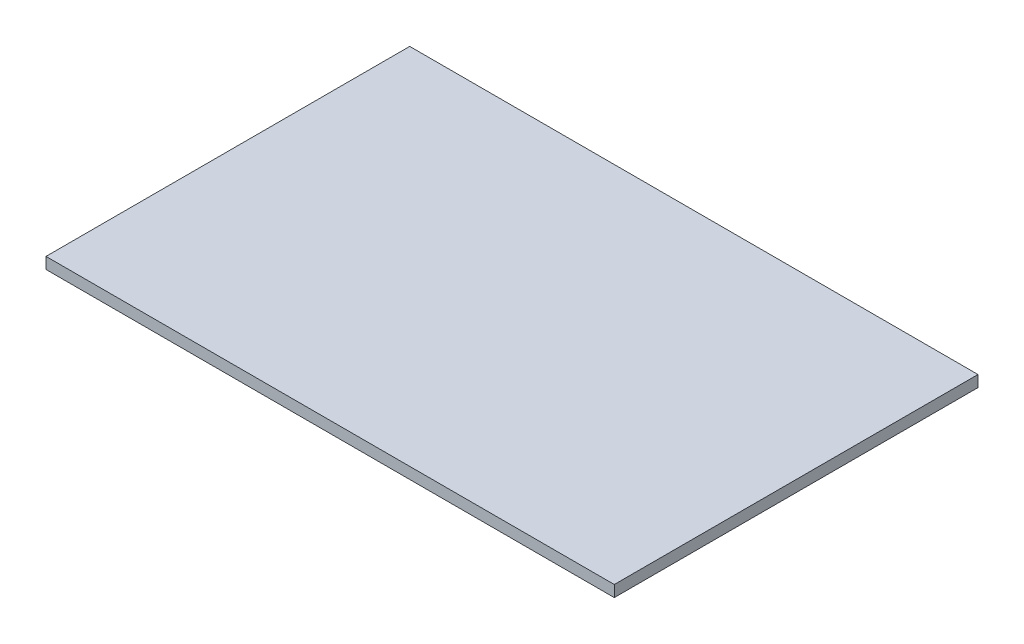
ISO-10303-21;
HEADER;
FILE_DESCRIPTION(('STEP AP214'),'2;1');
FILE_NAME('part.step','',(''),(''),'','','');
FILE_SCHEMA(('AUTOMOTIVE_DESIGN { 1 0 10303 214 1 1 1 1 }'));
ENDSEC;
DATA;
#1=APPLICATION_CONTEXT('core data for automotive mechanical design processes');
#2=APPLICATION_PROTOCOL_DEFINITION('international standard','automotive_design',2000,#1);
#3=PRODUCT_CONTEXT('',#1,'mechanical');
#4=PRODUCT('Part','Part','',(#3));
#5=PRODUCT_RELATED_PRODUCT_CATEGORY('part','',(#4));
#6=PRODUCT_DEFINITION_FORMATION('','',#4);
#7=PRODUCT_DEFINITION_CONTEXT('part definition',#1,'design');
#8=PRODUCT_DEFINITION('design','',#6,#7);
#9=PRODUCT_DEFINITION_SHAPE('','',#8);
#10=(LENGTH_UNIT() NAMED_UNIT(*) SI_UNIT(.MILLI.,.METRE.));
#11=(NAMED_UNIT(*) PLANE_ANGLE_UNIT() SI_UNIT($,.RADIAN.));
#12=(NAMED_UNIT(*) SI_UNIT($,.STERADIAN.) SOLID_ANGLE_UNIT());
#13=UNCERTAINTY_MEASURE_WITH_UNIT(LENGTH_MEASURE(1.E-05),#10,'distance_accuracy_value','');
#14=(GEOMETRIC_REPRESENTATION_CONTEXT(3) GLOBAL_UNCERTAINTY_ASSIGNED_CONTEXT((#13)) GLOBAL_UNIT_ASSIGNED_CONTEXT((#10,
#11,#12)) REPRESENTATION_CONTEXT('',''));
#15=CARTESIAN_POINT('',(0.,0.,0.));
#16=DIRECTION('',(0.,0.,1.));
#17=DIRECTION('',(1.,0.,0.));
#18=AXIS2_PLACEMENT_3D('',#15,#16,#17);
#19=CARTESIAN_POINT('',(125.,5.,80.));
#20=DIRECTION('',(-1.,0.,0.));
#21=DIRECTION('',(0.,0.,1.));
#22=AXIS2_PLACEMENT_3D('',#19,#20,#21);
#23=PLANE('',#22);
#24=DIRECTION('',(0.,0.,-1.));
#25=VECTOR('',#24,1.);
#26=CARTESIAN_POINT('',(125.,0.,80.));
#27=LINE('',#26,#25);
#28=CARTESIAN_POINT('',(125.,0.,80.));
#29=VERTEX_POINT('',#28);
#30=CARTESIAN_POINT('',(125.,0.,-80.));
#31=VERTEX_POINT('',#30);
#32=EDGE_CURVE('E96',#29,#31,#27,.T.);
#33=ORIENTED_EDGE('',*,*,#32,.T.);
#34=DIRECTION('',(0.,-1.,0.));
#35=VECTOR('',#34,1.);
#36=CARTESIAN_POINT('',(125.,5.,-80.));
#37=LINE('',#36,#35);
#38=CARTESIAN_POINT('',(125.,5.,-80.));
#39=VERTEX_POINT('',#38);
#40=EDGE_CURVE('E11',#39,#31,#37,.T.);
#41=ORIENTED_EDGE('',*,*,#40,.F.);
#42=DIRECTION('',(0.,0.,-1.));
#43=VECTOR('',#42,1.);
#44=CARTESIAN_POINT('',(125.,5.,80.));
#45=LINE('',#44,#43);
#46=CARTESIAN_POINT('',(125.,5.,80.));
#47=VERTEX_POINT('',#46);
#48=EDGE_CURVE('E84',#47,#39,#45,.T.);
#49=ORIENTED_EDGE('',*,*,#48,.F.);
#50=DIRECTION('',(0.,-1.,0.));
#51=VECTOR('',#50,1.);
#52=CARTESIAN_POINT('',(125.,5.,80.));
#53=LINE('',#52,#51);
#54=EDGE_CURVE('E92',#47,#29,#53,.T.);
#55=ORIENTED_EDGE('',*,*,#54,.T.);
#56=EDGE_LOOP('',(#33,#41,#49,#55));
#57=FACE_BOUND('',#56,.T.);
#58=ADVANCED_FACE('F33',(#57),#23,.F.);
#59=CARTESIAN_POINT('',(-125.,5.,-80.));
#60=DIRECTION('',(0.,0.,1.));
#61=DIRECTION('',(1.,0.,0.));
#62=AXIS2_PLACEMENT_3D('',#59,#60,#61);
#63=PLANE('',#62);
#64=DIRECTION('',(-1.,0.,0.));
#65=VECTOR('',#64,1.);
#66=CARTESIAN_POINT('',(-125.,0.,-80.));
#67=LINE('',#66,#65);
#68=CARTESIAN_POINT('',(-125.,0.,-80.));
#69=VERTEX_POINT('',#68);
#70=EDGE_CURVE('E88',#31,#69,#67,.T.);
#71=ORIENTED_EDGE('',*,*,#70,.T.);
#72=DIRECTION('',(0.,-1.,0.));
#73=VECTOR('',#72,1.);
#74=CARTESIAN_POINT('',(-125.,5.,-80.));
#75=LINE('',#74,#73);
#76=CARTESIAN_POINT('',(-125.,5.,-80.));
#77=VERTEX_POINT('',#76);
#78=EDGE_CURVE('E41',#77,#69,#75,.T.);
#79=ORIENTED_EDGE('',*,*,#78,.F.);
#80=DIRECTION('',(-1.,0.,0.));
#81=VECTOR('',#80,1.);
#82=CARTESIAN_POINT('',(-125.,5.,-80.));
#83=LINE('',#82,#81);
#84=EDGE_CURVE('E79',#39,#77,#83,.T.);
#85=ORIENTED_EDGE('',*,*,#84,.F.);
#86=ORIENTED_EDGE('',*,*,#40,.T.);
#87=EDGE_LOOP('',(#71,#79,#85,#86));
#88=FACE_BOUND('',#87,.T.);
#89=ADVANCED_FACE('F87',(#88),#63,.F.);
#90=CARTESIAN_POINT('',(-125.,5.,80.));
#91=DIRECTION('',(1.,0.,0.));
#92=DIRECTION('',(0.,0.,-1.));
#93=AXIS2_PLACEMENT_3D('',#90,#91,#92);
#94=PLANE('',#93);
#95=DIRECTION('',(0.,0.,1.));
#96=VECTOR('',#95,1.);
#97=CARTESIAN_POINT('',(-125.,0.,80.));
#98=LINE('',#97,#96);
#99=CARTESIAN_POINT('',(-125.,0.,80.));
#100=VERTEX_POINT('',#99);
#101=EDGE_CURVE('E66',#69,#100,#98,.T.);
#102=ORIENTED_EDGE('',*,*,#101,.T.);
#103=DIRECTION('',(0.,-1.,0.));
#104=VECTOR('',#103,1.);
#105=CARTESIAN_POINT('',(-125.,5.,80.));
#106=LINE('',#105,#104);
#107=CARTESIAN_POINT('',(-125.,5.,80.));
#108=VERTEX_POINT('',#107);
#109=EDGE_CURVE('E89',#108,#100,#106,.T.);
#110=ORIENTED_EDGE('',*,*,#109,.F.);
#111=DIRECTION('',(0.,0.,1.));
#112=VECTOR('',#111,1.);
#113=CARTESIAN_POINT('',(-125.,5.,80.));
#114=LINE('',#113,#112);
#115=EDGE_CURVE('E82',#77,#108,#114,.T.);
#116=ORIENTED_EDGE('',*,*,#115,.F.);
#117=ORIENTED_EDGE('',*,*,#78,.T.);
#118=EDGE_LOOP('',(#102,#110,#116,#117));
#119=FACE_BOUND('',#118,.T.);
#120=ADVANCED_FACE('F90',(#119),#94,.F.);
#121=CARTESIAN_POINT('',(-125.,5.,80.));
#122=DIRECTION('',(0.,0.,-1.));
#123=DIRECTION('',(-1.,0.,0.));
#124=AXIS2_PLACEMENT_3D('',#121,#122,#123);
#125=PLANE('',#124);
#126=DIRECTION('',(1.,0.,0.));
#127=VECTOR('',#126,1.);
#128=CARTESIAN_POINT('',(-125.,0.,80.));
#129=LINE('',#128,#127);
#130=EDGE_CURVE('E72',#100,#29,#129,.T.);
#131=ORIENTED_EDGE('',*,*,#130,.T.);
#132=ORIENTED_EDGE('',*,*,#54,.F.);
#133=DIRECTION('',(1.,0.,0.));
#134=VECTOR('',#133,1.);
#135=CARTESIAN_POINT('',(-125.,5.,80.));
#136=LINE('',#135,#134);
#137=EDGE_CURVE('E49',#108,#47,#136,.T.);
#138=ORIENTED_EDGE('',*,*,#137,.F.);
#139=ORIENTED_EDGE('',*,*,#109,.T.);
#140=EDGE_LOOP('',(#131,#132,#138,#139));
#141=FACE_BOUND('',#140,.T.);
#142=ADVANCED_FACE('F103',(#141),#125,.F.);
#143=CARTESIAN_POINT('',(0.,5.,0.));
#144=DIRECTION('',(0.,-1.,0.));
#145=DIRECTION('',(0.,0.,-1.));
#146=AXIS2_PLACEMENT_3D('',#143,#144,#145);
#147=PLANE('',#146);
#148=ORIENTED_EDGE('',*,*,#48,.T.);
#149=ORIENTED_EDGE('',*,*,#84,.T.);
#150=ORIENTED_EDGE('',*,*,#115,.T.);
#151=ORIENTED_EDGE('',*,*,#137,.T.);
#152=EDGE_LOOP('',(#148,#149,#150,#151));
#153=FACE_BOUND('',#152,.T.);
#154=ADVANCED_FACE('F80',(#153),#147,.F.);
#155=CARTESIAN_POINT('',(0.,0.,0.));
#156=DIRECTION('',(0.,-1.,0.));
#157=DIRECTION('',(0.,0.,-1.));
#158=AXIS2_PLACEMENT_3D('',#155,#156,#157);
#159=PLANE('',#158);
#160=ORIENTED_EDGE('',*,*,#32,.F.);
#161=ORIENTED_EDGE('',*,*,#130,.F.);
#162=ORIENTED_EDGE('',*,*,#101,.F.);
#163=ORIENTED_EDGE('',*,*,#70,.F.);
#164=EDGE_LOOP('',(#160,#161,#162,#163));
#165=FACE_BOUND('',#164,.T.);
#166=ADVANCED_FACE('F106',(#165),#159,.T.);
#167=CLOSED_SHELL('',(#58,#89,#120,#142,#154,#166));
#168=MANIFOLD_SOLID_BREP('B2',#167);
#169=ADVANCED_BREP_SHAPE_REPRESENTATION('',(#18,#168),#14);
#170=SHAPE_DEFINITION_REPRESENTATION(#9,#169);
ENDSEC;
END-ISO-10303-21;
